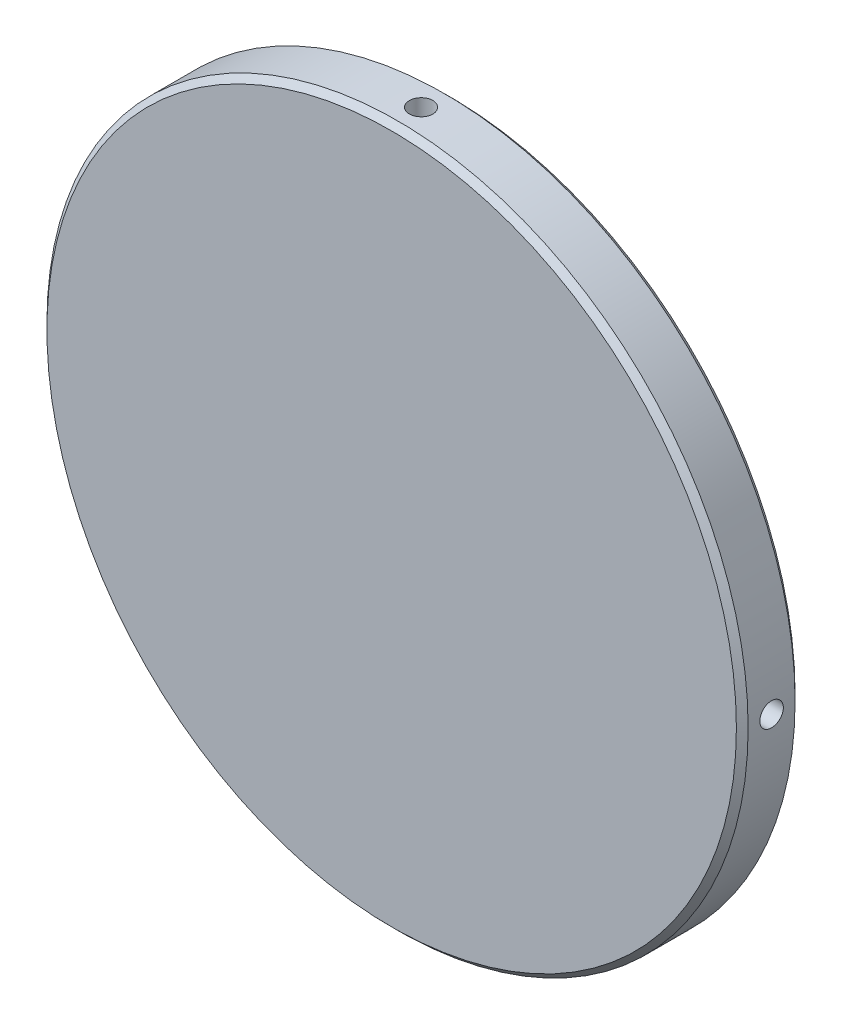
ISO-10303-21;
HEADER;
FILE_DESCRIPTION(('STEP AP214'),'2;1');
FILE_NAME('part.step','',(''),(''),'','','');
FILE_SCHEMA(('AUTOMOTIVE_DESIGN { 1 0 10303 214 1 1 1 1 }'));
ENDSEC;
DATA;
#1=APPLICATION_CONTEXT('core data for automotive mechanical design processes');
#2=APPLICATION_PROTOCOL_DEFINITION('international standard','automotive_design',2000,#1);
#3=PRODUCT_CONTEXT('',#1,'mechanical');
#4=PRODUCT('Part','Part','',(#3));
#5=PRODUCT_RELATED_PRODUCT_CATEGORY('part','',(#4));
#6=PRODUCT_DEFINITION_FORMATION('','',#4);
#7=PRODUCT_DEFINITION_CONTEXT('part definition',#1,'design');
#8=PRODUCT_DEFINITION('design','',#6,#7);
#9=PRODUCT_DEFINITION_SHAPE('','',#8);
#10=(LENGTH_UNIT() NAMED_UNIT(*) SI_UNIT(.MILLI.,.METRE.));
#11=(NAMED_UNIT(*) PLANE_ANGLE_UNIT() SI_UNIT($,.RADIAN.));
#12=(NAMED_UNIT(*) SI_UNIT($,.STERADIAN.) SOLID_ANGLE_UNIT());
#13=UNCERTAINTY_MEASURE_WITH_UNIT(LENGTH_MEASURE(1.E-05),#10,'distance_accuracy_value','');
#14=(GEOMETRIC_REPRESENTATION_CONTEXT(3) GLOBAL_UNCERTAINTY_ASSIGNED_CONTEXT((#13)) GLOBAL_UNIT_ASSIGNED_CONTEXT((#10,
#11,#12)) REPRESENTATION_CONTEXT('',''));
#15=CARTESIAN_POINT('',(0.,0.,0.));
#16=DIRECTION('',(0.,0.,1.));
#17=DIRECTION('',(1.,0.,0.));
#18=AXIS2_PLACEMENT_3D('',#15,#16,#17);
#19=CARTESIAN_POINT('',(0.,0.,5.));
#20=DIRECTION('',(0.,0.,-1.));
#21=DIRECTION('',(-1.,0.,0.));
#22=AXIS2_PLACEMENT_3D('',#19,#20,#21);
#23=CYLINDRICAL_SURFACE('',#22,59.75);
#24=CARTESIAN_POINT('',(-59.75,0.,2.));
#25=CARTESIAN_POINT('',(-59.7499995494594,-0.112307129997341,1.99999503000864));
#26=CARTESIAN_POINT('',(-59.7496799623201,-0.224694892246602,1.99050857638082));
#27=CARTESIAN_POINT('',(-59.74843578904,-0.44637288480864,1.95279816909204));
#28=CARTESIAN_POINT('',(-59.747510481599,-0.555659259858168,1.9245518753627));
#29=CARTESIAN_POINT('',(-59.7451596481446,-0.767890990604416,1.85012887181395));
#30=CARTESIAN_POINT('',(-59.7437343682783,-0.870839437334808,1.80396098398917));
#31=CARTESIAN_POINT('',(-59.7405443243233,-1.06749626686225,1.69501810962479));
#32=CARTESIAN_POINT('',(-59.7387796427583,-1.16120688742617,1.6322471586408));
#33=CARTESIAN_POINT('',(-59.7351084200542,-1.33680655707057,1.49184132171374));
#34=CARTESIAN_POINT('',(-59.7332018148393,-1.41869021685021,1.41419969676134));
#35=CARTESIAN_POINT('',(-59.7294621934981,-1.56826610153817,1.24626867404818));
#36=CARTESIAN_POINT('',(-59.7276291803151,-1.6359577592841,1.15597877105813));
#37=CARTESIAN_POINT('',(-59.7242430934818,-1.75523823779969,0.965292006070528));
#38=CARTESIAN_POINT('',(-59.7226900805231,-1.8068235692095,0.864892960196646));
#39=CARTESIAN_POINT('',(-59.720039760799,-1.89240446748466,0.656853382837109));
#40=CARTESIAN_POINT('',(-59.7189424519817,-1.92640011355139,0.549212883960141));
#41=CARTESIAN_POINT('',(-59.7173277687406,-1.97582434920251,0.329788961371232));
#42=CARTESIAN_POINT('',(-59.7168101754089,-1.99125994745508,0.218007117966453));
#43=CARTESIAN_POINT('',(-59.7164126269457,-2.00314752593443,-0.00656223973413725));
#44=CARTESIAN_POINT('',(-59.7165326689263,-1.99959959213284,-0.11934974947323));
#45=CARTESIAN_POINT('',(-59.7173966504134,-1.97362672232544,-0.342681262555111));
#46=CARTESIAN_POINT('',(-59.718140339607,-1.95120935991124,-0.453226147788876));
#47=CARTESIAN_POINT('',(-59.7201673876427,-1.88814569901528,-0.668982714899182));
#48=CARTESIAN_POINT('',(-59.7214507478238,-1.84749935530442,-0.77419438354241));
#49=CARTESIAN_POINT('',(-59.724412758355,-1.74912284593875,-0.976322323621341));
#50=CARTESIAN_POINT('',(-59.7260914889563,-1.69138921134002,-1.07323690548402));
#51=CARTESIAN_POINT('',(-59.7296549181386,-1.56047953389872,-1.25600109518055));
#52=CARTESIAN_POINT('',(-59.7315396173256,-1.48730344561042,-1.34185067044989));
#53=CARTESIAN_POINT('',(-59.7353036411625,-1.32754323552336,-1.50009200397242));
#54=CARTESIAN_POINT('',(-59.7371829627191,-1.24095254817405,-1.57247713389565));
#55=CARTESIAN_POINT('',(-59.7407234875021,-1.05684428323877,-1.70168378480539));
#56=CARTESIAN_POINT('',(-59.7423846906912,-0.959326703778446,-1.75850530312217));
#57=CARTESIAN_POINT('',(-59.7453017515693,-0.756129117794124,-1.85497104580186));
#58=CARTESIAN_POINT('',(-59.7465576042649,-0.650449010737833,-1.89461505856136));
#59=CARTESIAN_POINT('',(-59.7485223224016,-0.433927916839957,-1.9555961926478));
#60=CARTESIAN_POINT('',(-59.7492311896904,-0.323086947433499,-1.97693337581661));
#61=CARTESIAN_POINT('',(-59.7500217960191,-0.0994480965300977,-2.00068703588301));
#62=CARTESIAN_POINT('',(-59.7501038390329,0.0133488098461575,-2.0031126838075));
#63=CARTESIAN_POINT('',(-59.74963235433,0.237748216697406,-1.9889983220716));
#64=CARTESIAN_POINT('',(-59.7490788275375,0.349350718909133,-1.97245833999215));
#65=CARTESIAN_POINT('',(-59.7473987769684,0.568167735009509,-1.92088981902588));
#66=CARTESIAN_POINT('',(-59.7462723823469,0.67538323207993,-1.88586544744381));
#67=CARTESIAN_POINT('',(-59.7435735083395,0.882412975055238,-1.79832659112254));
#68=CARTESIAN_POINT('',(-59.7420010278256,0.982227202245687,-1.74581206216055));
#69=CARTESIAN_POINT('',(-59.7385863325639,1.17166323795131,-1.62475999218066));
#70=CARTESIAN_POINT('',(-59.7367440140705,1.26128110258538,-1.55621628229767));
#71=CARTESIAN_POINT('',(-59.7329975979015,1.42774087152736,-1.40506060829181));
#72=CARTESIAN_POINT('',(-59.7310935000354,1.50458273642679,-1.32244860077587));
#73=CARTESIAN_POINT('',(-59.7274373090444,1.64333990377229,-1.14546206479679));
#74=CARTESIAN_POINT('',(-59.7256852763786,1.70524928651931,-1.05108289388213));
#75=CARTESIAN_POINT('',(-59.7225317048952,1.81234364178051,-0.853264761031606));
#76=CARTESIAN_POINT('',(-59.721130165186,1.85752865684077,-0.74982582214423));
#77=CARTESIAN_POINT('',(-59.71883603554,1.92988127152684,-0.536846643981409));
#78=CARTESIAN_POINT('',(-59.7179433376335,1.95705269360931,-0.427307704467907));
#79=CARTESIAN_POINT('',(-59.7167672399918,1.9926193508434,-0.205219560769743));
#80=CARTESIAN_POINT('',(-59.7164838393189,2.00101461488827,-0.0926703612176207));
#81=CARTESIAN_POINT('',(-59.7165583280262,1.99879021204282,0.132184275801783));
#82=CARTESIAN_POINT('',(-59.7169159027398,1.98817987535172,0.244489805793972));
#83=CARTESIAN_POINT('',(-59.7182313713311,1.94826466733698,0.465724501536171));
#84=CARTESIAN_POINT('',(-59.7191892663936,1.91895975911528,0.574653660621688));
#85=CARTESIAN_POINT('',(-59.7215973407515,1.8424887206737,0.786046649476031));
#86=CARTESIAN_POINT('',(-59.7230475278561,1.79532230711185,0.88851037665185));
#87=CARTESIAN_POINT('',(-59.7262766495666,1.68446986761081,1.08406317603627));
#88=CARTESIAN_POINT('',(-59.7280555725325,1.62078442655538,1.17715257999648));
#89=CARTESIAN_POINT('',(-59.7317425486591,1.47867243456736,1.35135827985876));
#90=CARTESIAN_POINT('',(-59.7336506511601,1.40024023053822,1.43246996280219));
#91=CARTESIAN_POINT('',(-59.7373808573279,1.23084895277022,1.58039739392635));
#92=CARTESIAN_POINT('',(-59.739202939603,1.13988678483117,1.64720960049673));
#93=CARTESIAN_POINT('',(-59.7425564382163,0.947977189914769,1.76465558393842));
#94=CARTESIAN_POINT('',(-59.7440876529884,0.847022911732809,1.815278158156));
#95=CARTESIAN_POINT('',(-59.7466833240624,0.638120657191286,1.89879623936388));
#96=CARTESIAN_POINT('',(-59.7477483359508,0.530181182413261,1.9317128577802));
#97=CARTESIAN_POINT('',(-59.7490073617991,0.351301159246687,1.97017369093094));
#98=CARTESIAN_POINT('',(-59.74937798314,0.281521364538284,1.98134445497179));
#99=CARTESIAN_POINT('',(-59.7498744438112,0.141171668303215,1.99625917032665));
#100=CARTESIAN_POINT('',(-59.7500002832319,0.0706017670680063,2.00000312438019));
#101=CARTESIAN_POINT('',(-59.75,0.,2.));
#102=B_SPLINE_CURVE_WITH_KNOTS('',3,(#24,#25,#26,#27,#28,#29,#30,#31,#32,#33,#34,#35,#36,#37,
#38,#39,#40,#41,#42,#43,#44,#45,#46,#47,#48,#49,#50,#51,#52,#53,#54,#55,#56,#57,#58,#59,#60,#61,
#62,#63,#64,#65,#66,#67,#68,#69,#70,#71,#72,#73,#74,#75,#76,#77,#78,#79,#80,#81,#82,#83,#84,#85,
#86,#87,#88,#89,#90,#91,#92,#93,#94,#95,#96,#97,#98,#99,#100,#101),.UNSPECIFIED.,.T.,.F.,(4,2,2,
2,2,2,2,2,2,2,2,2,2,2,2,2,2,2,2,2,2,2,2,2,2,2,2,2,2,2,2,2,2,2,2,2,2,2,4),(0.,0.336663682027249,
0.673728999013756,1.01062860388358,1.34744639675886,1.68441718955387,2.02140144632314,
2.35845865857089,2.69551435313184,3.03244272829218,3.36936957758993,3.70616125955853,
4.0429537771675,4.37981471502453,4.71667664424653,5.05370396882304,5.39073135121246,
5.72776288520078,6.06479328066593,6.40166022524484,6.73852667993279,7.07531722051715,
7.41210861266226,7.74902983363537,8.08595209384654,8.42300770176811,8.76006245222878,
9.09704565727869,9.43402834376934,9.77084564459304,10.1076636102055,10.4444869190778,
10.7812983037856,11.118239067648,11.4552631866949,11.7925200124573,12.1293738187843,
12.3410171901982,12.5526604835431),.UNSPECIFIED.);
#103=CARTESIAN_POINT('',(-59.75,0.,2.));
#104=VERTEX_POINT('',#103);
#105=EDGE_CURVE('E38',#104,#104,#102,.T.);
#106=ORIENTED_EDGE('',*,*,#105,.T.);
#107=EDGE_LOOP('',(#106));
#108=FACE_BOUND('',#107,.T.);
#109=CARTESIAN_POINT('',(0.,-59.75,2.));
#110=CARTESIAN_POINT('',(0.112307129997341,-59.7499995494594,1.99999503000864));
#111=CARTESIAN_POINT('',(0.224694892246602,-59.7496799623201,1.99050857638082));
#112=CARTESIAN_POINT('',(0.44637288480864,-59.74843578904,1.95279816909204));
#113=CARTESIAN_POINT('',(0.555659259858168,-59.747510481599,1.9245518753627));
#114=CARTESIAN_POINT('',(0.767890990604416,-59.7451596481446,1.85012887181395));
#115=CARTESIAN_POINT('',(0.870839437334808,-59.7437343682783,1.80396098398917));
#116=CARTESIAN_POINT('',(1.06749626686225,-59.7405443243233,1.69501810962479));
#117=CARTESIAN_POINT('',(1.16120688742617,-59.7387796427583,1.6322471586408));
#118=CARTESIAN_POINT('',(1.33680655707057,-59.7351084200542,1.49184132171374));
#119=CARTESIAN_POINT('',(1.41869021685021,-59.7332018148393,1.41419969676134));
#120=CARTESIAN_POINT('',(1.56826610153817,-59.7294621934981,1.24626867404818));
#121=CARTESIAN_POINT('',(1.6359577592841,-59.7276291803151,1.15597877105813));
#122=CARTESIAN_POINT('',(1.75523823779969,-59.7242430934818,0.965292006070528));
#123=CARTESIAN_POINT('',(1.8068235692095,-59.7226900805231,0.864892960196646));
#124=CARTESIAN_POINT('',(1.89240446748466,-59.720039760799,0.656853382837109));
#125=CARTESIAN_POINT('',(1.92640011355139,-59.7189424519817,0.549212883960141));
#126=CARTESIAN_POINT('',(1.97582434920251,-59.7173277687406,0.329788961371232));
#127=CARTESIAN_POINT('',(1.99125994745508,-59.7168101754089,0.218007117966453));
#128=CARTESIAN_POINT('',(2.00314752593443,-59.7164126269457,-0.00656223973413725));
#129=CARTESIAN_POINT('',(1.99959959213284,-59.7165326689263,-0.11934974947323));
#130=CARTESIAN_POINT('',(1.97362672232544,-59.7173966504134,-0.342681262555111));
#131=CARTESIAN_POINT('',(1.95120935991124,-59.718140339607,-0.453226147788876));
#132=CARTESIAN_POINT('',(1.88814569901528,-59.7201673876427,-0.668982714899182));
#133=CARTESIAN_POINT('',(1.84749935530442,-59.7214507478238,-0.77419438354241));
#134=CARTESIAN_POINT('',(1.74912284593875,-59.724412758355,-0.976322323621341));
#135=CARTESIAN_POINT('',(1.69138921134002,-59.7260914889563,-1.07323690548402));
#136=CARTESIAN_POINT('',(1.56047953389872,-59.7296549181386,-1.25600109518055));
#137=CARTESIAN_POINT('',(1.48730344561042,-59.7315396173256,-1.34185067044989));
#138=CARTESIAN_POINT('',(1.32754323552336,-59.7353036411625,-1.50009200397242));
#139=CARTESIAN_POINT('',(1.24095254817405,-59.7371829627191,-1.57247713389565));
#140=CARTESIAN_POINT('',(1.05684428323877,-59.7407234875021,-1.70168378480539));
#141=CARTESIAN_POINT('',(0.959326703778446,-59.7423846906912,-1.75850530312217));
#142=CARTESIAN_POINT('',(0.756129117794124,-59.7453017515693,-1.85497104580186));
#143=CARTESIAN_POINT('',(0.650449010737833,-59.7465576042649,-1.89461505856136));
#144=CARTESIAN_POINT('',(0.433927916839957,-59.7485223224016,-1.9555961926478));
#145=CARTESIAN_POINT('',(0.323086947433499,-59.7492311896904,-1.97693337581661));
#146=CARTESIAN_POINT('',(0.0994480965300977,-59.7500217960191,-2.00068703588301));
#147=CARTESIAN_POINT('',(-0.0133488098461575,-59.7501038390329,-2.0031126838075));
#148=CARTESIAN_POINT('',(-0.237748216697406,-59.74963235433,-1.9889983220716));
#149=CARTESIAN_POINT('',(-0.349350718909133,-59.7490788275375,-1.97245833999215));
#150=CARTESIAN_POINT('',(-0.568167735009509,-59.7473987769684,-1.92088981902588));
#151=CARTESIAN_POINT('',(-0.67538323207993,-59.7462723823469,-1.88586544744381));
#152=CARTESIAN_POINT('',(-0.882412975055238,-59.7435735083395,-1.79832659112254));
#153=CARTESIAN_POINT('',(-0.982227202245687,-59.7420010278256,-1.74581206216055));
#154=CARTESIAN_POINT('',(-1.17166323795131,-59.7385863325639,-1.62475999218066));
#155=CARTESIAN_POINT('',(-1.26128110258538,-59.7367440140705,-1.55621628229767));
#156=CARTESIAN_POINT('',(-1.42774087152736,-59.7329975979015,-1.40506060829181));
#157=CARTESIAN_POINT('',(-1.50458273642679,-59.7310935000354,-1.32244860077587));
#158=CARTESIAN_POINT('',(-1.64333990377229,-59.7274373090444,-1.14546206479679));
#159=CARTESIAN_POINT('',(-1.70524928651931,-59.7256852763786,-1.05108289388213));
#160=CARTESIAN_POINT('',(-1.81234364178051,-59.7225317048952,-0.853264761031606));
#161=CARTESIAN_POINT('',(-1.85752865684077,-59.721130165186,-0.74982582214423));
#162=CARTESIAN_POINT('',(-1.92988127152684,-59.71883603554,-0.536846643981409));
#163=CARTESIAN_POINT('',(-1.95705269360931,-59.7179433376335,-0.427307704467907));
#164=CARTESIAN_POINT('',(-1.9926193508434,-59.7167672399918,-0.205219560769743));
#165=CARTESIAN_POINT('',(-2.00101461488827,-59.7164838393189,-0.0926703612176207));
#166=CARTESIAN_POINT('',(-1.99879021204282,-59.7165583280262,0.132184275801783));
#167=CARTESIAN_POINT('',(-1.98817987535172,-59.7169159027398,0.244489805793972));
#168=CARTESIAN_POINT('',(-1.94826466733698,-59.7182313713311,0.465724501536171));
#169=CARTESIAN_POINT('',(-1.91895975911528,-59.7191892663936,0.574653660621688));
#170=CARTESIAN_POINT('',(-1.8424887206737,-59.7215973407515,0.786046649476031));
#171=CARTESIAN_POINT('',(-1.79532230711185,-59.7230475278561,0.88851037665185));
#172=CARTESIAN_POINT('',(-1.68446986761081,-59.7262766495666,1.08406317603627));
#173=CARTESIAN_POINT('',(-1.62078442655538,-59.7280555725325,1.17715257999648));
#174=CARTESIAN_POINT('',(-1.47867243456736,-59.7317425486591,1.35135827985876));
#175=CARTESIAN_POINT('',(-1.40024023053822,-59.7336506511601,1.43246996280219));
#176=CARTESIAN_POINT('',(-1.23084895277022,-59.7373808573279,1.58039739392635));
#177=CARTESIAN_POINT('',(-1.13988678483117,-59.739202939603,1.64720960049673));
#178=CARTESIAN_POINT('',(-0.947977189914769,-59.7425564382163,1.76465558393842));
#179=CARTESIAN_POINT('',(-0.847022911732809,-59.7440876529884,1.815278158156));
#180=CARTESIAN_POINT('',(-0.638120657191286,-59.7466833240624,1.89879623936388));
#181=CARTESIAN_POINT('',(-0.530181182413261,-59.7477483359508,1.9317128577802));
#182=CARTESIAN_POINT('',(-0.351301159246687,-59.7490073617991,1.97017369093094));
#183=CARTESIAN_POINT('',(-0.281521364538284,-59.74937798314,1.98134445497179));
#184=CARTESIAN_POINT('',(-0.141171668303215,-59.7498744438112,1.99625917032665));
#185=CARTESIAN_POINT('',(-0.0706017670680063,-59.7500002832319,2.00000312438019));
#186=CARTESIAN_POINT('',(0.,-59.75,2.));
#187=B_SPLINE_CURVE_WITH_KNOTS('',3,(#109,#110,#111,#112,#113,#114,#115,#116,#117,#118,#119,
#120,#121,#122,#123,#124,#125,#126,#127,#128,#129,#130,#131,#132,#133,#134,#135,#136,#137,#138,
#139,#140,#141,#142,#143,#144,#145,#146,#147,#148,#149,#150,#151,#152,#153,#154,#155,#156,#157,
#158,#159,#160,#161,#162,#163,#164,#165,#166,#167,#168,#169,#170,#171,#172,#173,#174,#175,#176,
#177,#178,#179,#180,#181,#182,#183,#184,#185,#186),.UNSPECIFIED.,.T.,.F.,(4,2,2,2,2,2,2,2,2,2,2,
2,2,2,2,2,2,2,2,2,2,2,2,2,2,2,2,2,2,2,2,2,2,2,2,2,2,2,4),(0.,0.336663682027249,
0.673728999013756,1.01062860388358,1.34744639675886,1.68441718955387,2.02140144632314,
2.35845865857089,2.69551435313184,3.03244272829218,3.36936957758993,3.70616125955853,
4.0429537771675,4.37981471502453,4.71667664424653,5.05370396882304,5.39073135121246,
5.72776288520078,6.06479328066593,6.40166022524484,6.73852667993279,7.07531722051715,
7.41210861266226,7.74902983363537,8.08595209384654,8.42300770176811,8.76006245222878,
9.09704565727869,9.43402834376934,9.77084564459304,10.1076636102055,10.4444869190778,
10.7812983037856,11.118239067648,11.4552631866949,11.7925200124573,12.1293738187843,
12.3410171901982,12.5526604835431),.UNSPECIFIED.);
#188=CARTESIAN_POINT('',(0.,-59.75,2.));
#189=VERTEX_POINT('',#188);
#190=EDGE_CURVE('E65',#189,#189,#187,.T.);
#191=ORIENTED_EDGE('',*,*,#190,.T.);
#192=EDGE_LOOP('',(#191));
#193=FACE_BOUND('',#192,.T.);
#194=CARTESIAN_POINT('',(0.,0.,-3.99999999999999));
#195=DIRECTION('',(0.,0.,1.));
#196=DIRECTION('',(1.,0.,0.));
#197=AXIS2_PLACEMENT_3D('',#194,#195,#196);
#198=CIRCLE('',#197,59.75);
#199=CARTESIAN_POINT('',(59.75,0.,-3.99999999999999));
#200=VERTEX_POINT('',#199);
#201=EDGE_CURVE('E52',#200,#200,#198,.T.);
#202=ORIENTED_EDGE('',*,*,#201,.T.);
#203=EDGE_LOOP('',(#202));
#204=FACE_BOUND('',#203,.T.);
#205=CARTESIAN_POINT('',(0.,0.,3.99999999999994));
#206=DIRECTION('',(0.,0.,1.));
#207=DIRECTION('',(1.,0.,0.));
#208=AXIS2_PLACEMENT_3D('',#205,#206,#207);
#209=CIRCLE('',#208,59.75);
#210=CARTESIAN_POINT('',(59.75,0.,3.99999999999994));
#211=VERTEX_POINT('',#210);
#212=EDGE_CURVE('E63',#211,#211,#209,.F.);
#213=ORIENTED_EDGE('',*,*,#212,.T.);
#214=EDGE_LOOP('',(#213));
#215=FACE_BOUND('',#214,.T.);
#216=CARTESIAN_POINT('',(0.,59.75,-2.));
#217=CARTESIAN_POINT('',(-0.112307129997341,59.7499995494594,-1.99999503000864));
#218=CARTESIAN_POINT('',(-0.224694892246602,59.7496799623201,-1.99050857638082));
#219=CARTESIAN_POINT('',(-0.44637288480864,59.74843578904,-1.95279816909204));
#220=CARTESIAN_POINT('',(-0.555659259858168,59.747510481599,-1.9245518753627));
#221=CARTESIAN_POINT('',(-0.767890990604416,59.7451596481446,-1.85012887181395));
#222=CARTESIAN_POINT('',(-0.870839437334808,59.7437343682783,-1.80396098398917));
#223=CARTESIAN_POINT('',(-1.06749626686225,59.7405443243233,-1.69501810962479));
#224=CARTESIAN_POINT('',(-1.16120688742617,59.7387796427583,-1.6322471586408));
#225=CARTESIAN_POINT('',(-1.33680655707057,59.7351084200542,-1.49184132171374));
#226=CARTESIAN_POINT('',(-1.41869021685021,59.7332018148393,-1.41419969676134));
#227=CARTESIAN_POINT('',(-1.56826610153817,59.7294621934981,-1.24626867404818));
#228=CARTESIAN_POINT('',(-1.6359577592841,59.7276291803151,-1.15597877105813));
#229=CARTESIAN_POINT('',(-1.75523823779969,59.7242430934818,-0.965292006070528));
#230=CARTESIAN_POINT('',(-1.8068235692095,59.7226900805231,-0.864892960196646));
#231=CARTESIAN_POINT('',(-1.89240446748466,59.720039760799,-0.656853382837109));
#232=CARTESIAN_POINT('',(-1.92640011355139,59.7189424519817,-0.549212883960141));
#233=CARTESIAN_POINT('',(-1.97582434920251,59.7173277687406,-0.329788961371232));
#234=CARTESIAN_POINT('',(-1.99125994745508,59.7168101754089,-0.218007117966453));
#235=CARTESIAN_POINT('',(-2.00314752593443,59.7164126269457,0.00656223973413725));
#236=CARTESIAN_POINT('',(-1.99959959213284,59.7165326689263,0.11934974947323));
#237=CARTESIAN_POINT('',(-1.97362672232544,59.7173966504134,0.342681262555111));
#238=CARTESIAN_POINT('',(-1.95120935991124,59.718140339607,0.453226147788876));
#239=CARTESIAN_POINT('',(-1.88814569901528,59.7201673876427,0.668982714899182));
#240=CARTESIAN_POINT('',(-1.84749935530442,59.7214507478238,0.77419438354241));
#241=CARTESIAN_POINT('',(-1.74912284593875,59.724412758355,0.976322323621341));
#242=CARTESIAN_POINT('',(-1.69138921134002,59.7260914889563,1.07323690548402));
#243=CARTESIAN_POINT('',(-1.56047953389872,59.7296549181386,1.25600109518055));
#244=CARTESIAN_POINT('',(-1.48730344561042,59.7315396173256,1.34185067044989));
#245=CARTESIAN_POINT('',(-1.32754323552336,59.7353036411625,1.50009200397242));
#246=CARTESIAN_POINT('',(-1.24095254817405,59.7371829627191,1.57247713389565));
#247=CARTESIAN_POINT('',(-1.05684428323877,59.7407234875021,1.70168378480539));
#248=CARTESIAN_POINT('',(-0.959326703778446,59.7423846906912,1.75850530312217));
#249=CARTESIAN_POINT('',(-0.756129117794124,59.7453017515693,1.85497104580186));
#250=CARTESIAN_POINT('',(-0.650449010737833,59.7465576042649,1.89461505856136));
#251=CARTESIAN_POINT('',(-0.433927916839957,59.7485223224016,1.9555961926478));
#252=CARTESIAN_POINT('',(-0.323086947433499,59.7492311896904,1.97693337581661));
#253=CARTESIAN_POINT('',(-0.0994480965300977,59.7500217960191,2.00068703588301));
#254=CARTESIAN_POINT('',(0.0133488098461575,59.7501038390329,2.0031126838075));
#255=CARTESIAN_POINT('',(0.237748216697406,59.74963235433,1.9889983220716));
#256=CARTESIAN_POINT('',(0.349350718909133,59.7490788275375,1.97245833999215));
#257=CARTESIAN_POINT('',(0.568167735009509,59.7473987769684,1.92088981902588));
#258=CARTESIAN_POINT('',(0.67538323207993,59.7462723823469,1.88586544744381));
#259=CARTESIAN_POINT('',(0.882412975055238,59.7435735083395,1.79832659112254));
#260=CARTESIAN_POINT('',(0.982227202245687,59.7420010278256,1.74581206216055));
#261=CARTESIAN_POINT('',(1.17166323795131,59.7385863325639,1.62475999218066));
#262=CARTESIAN_POINT('',(1.26128110258538,59.7367440140705,1.55621628229767));
#263=CARTESIAN_POINT('',(1.42774087152736,59.7329975979015,1.40506060829181));
#264=CARTESIAN_POINT('',(1.50458273642679,59.7310935000354,1.32244860077587));
#265=CARTESIAN_POINT('',(1.64333990377229,59.7274373090444,1.14546206479679));
#266=CARTESIAN_POINT('',(1.70524928651931,59.7256852763786,1.05108289388213));
#267=CARTESIAN_POINT('',(1.81234364178051,59.7225317048952,0.853264761031606));
#268=CARTESIAN_POINT('',(1.85752865684077,59.721130165186,0.74982582214423));
#269=CARTESIAN_POINT('',(1.92988127152684,59.71883603554,0.536846643981409));
#270=CARTESIAN_POINT('',(1.95705269360931,59.7179433376335,0.427307704467907));
#271=CARTESIAN_POINT('',(1.9926193508434,59.7167672399918,0.205219560769743));
#272=CARTESIAN_POINT('',(2.00101461488827,59.7164838393189,0.0926703612176207));
#273=CARTESIAN_POINT('',(1.99879021204282,59.7165583280262,-0.132184275801783));
#274=CARTESIAN_POINT('',(1.98817987535172,59.7169159027398,-0.244489805793972));
#275=CARTESIAN_POINT('',(1.94826466733698,59.7182313713311,-0.465724501536171));
#276=CARTESIAN_POINT('',(1.91895975911528,59.7191892663936,-0.574653660621688));
#277=CARTESIAN_POINT('',(1.8424887206737,59.7215973407515,-0.786046649476031));
#278=CARTESIAN_POINT('',(1.79532230711185,59.7230475278561,-0.88851037665185));
#279=CARTESIAN_POINT('',(1.68446986761081,59.7262766495666,-1.08406317603627));
#280=CARTESIAN_POINT('',(1.62078442655538,59.7280555725325,-1.17715257999648));
#281=CARTESIAN_POINT('',(1.47867243456736,59.7317425486591,-1.35135827985876));
#282=CARTESIAN_POINT('',(1.40024023053822,59.7336506511601,-1.43246996280219));
#283=CARTESIAN_POINT('',(1.23084895277022,59.7373808573279,-1.58039739392635));
#284=CARTESIAN_POINT('',(1.13988678483117,59.739202939603,-1.64720960049673));
#285=CARTESIAN_POINT('',(0.947977189914769,59.7425564382163,-1.76465558393842));
#286=CARTESIAN_POINT('',(0.847022911732809,59.7440876529884,-1.815278158156));
#287=CARTESIAN_POINT('',(0.638120657191286,59.7466833240624,-1.89879623936388));
#288=CARTESIAN_POINT('',(0.530181182413261,59.7477483359508,-1.9317128577802));
#289=CARTESIAN_POINT('',(0.351301159246687,59.7490073617991,-1.97017369093094));
#290=CARTESIAN_POINT('',(0.281521364538284,59.74937798314,-1.98134445497179));
#291=CARTESIAN_POINT('',(0.141171668303215,59.7498744438112,-1.99625917032665));
#292=CARTESIAN_POINT('',(0.0706017670680063,59.7500002832319,-2.00000312438019));
#293=CARTESIAN_POINT('',(0.,59.75,-2.));
#294=B_SPLINE_CURVE_WITH_KNOTS('',3,(#216,#217,#218,#219,#220,#221,#222,#223,#224,#225,#226,
#227,#228,#229,#230,#231,#232,#233,#234,#235,#236,#237,#238,#239,#240,#241,#242,#243,#244,#245,
#246,#247,#248,#249,#250,#251,#252,#253,#254,#255,#256,#257,#258,#259,#260,#261,#262,#263,#264,
#265,#266,#267,#268,#269,#270,#271,#272,#273,#274,#275,#276,#277,#278,#279,#280,#281,#282,#283,
#284,#285,#286,#287,#288,#289,#290,#291,#292,#293),.UNSPECIFIED.,.T.,.F.,(4,2,2,2,2,2,2,2,2,2,2,
2,2,2,2,2,2,2,2,2,2,2,2,2,2,2,2,2,2,2,2,2,2,2,2,2,2,2,4),(0.,0.336663682027249,
0.673728999013756,1.01062860388358,1.34744639675886,1.68441718955387,2.02140144632314,
2.35845865857089,2.69551435313184,3.03244272829218,3.36936957758993,3.70616125955853,
4.0429537771675,4.37981471502453,4.71667664424653,5.05370396882304,5.39073135121246,
5.72776288520078,6.06479328066593,6.40166022524484,6.73852667993279,7.07531722051715,
7.41210861266226,7.74902983363537,8.08595209384654,8.42300770176811,8.76006245222878,
9.09704565727869,9.43402834376934,9.77084564459304,10.1076636102055,10.4444869190778,
10.7812983037856,11.118239067648,11.4552631866949,11.7925200124573,12.1293738187843,
12.3410171901982,12.5526604835431),.UNSPECIFIED.);
#295=CARTESIAN_POINT('',(0.,59.75,-2.));
#296=VERTEX_POINT('',#295);
#297=EDGE_CURVE('E56',#296,#296,#294,.T.);
#298=ORIENTED_EDGE('',*,*,#297,.F.);
#299=EDGE_LOOP('',(#298));
#300=FACE_BOUND('',#299,.T.);
#301=CARTESIAN_POINT('',(59.75,0.,2.));
#302=CARTESIAN_POINT('',(59.7499995494594,-0.112307129997341,1.99999503000864));
#303=CARTESIAN_POINT('',(59.7496799623201,-0.224694892246602,1.99050857638082));
#304=CARTESIAN_POINT('',(59.74843578904,-0.44637288480864,1.95279816909204));
#305=CARTESIAN_POINT('',(59.747510481599,-0.555659259858168,1.9245518753627));
#306=CARTESIAN_POINT('',(59.7451596481446,-0.767890990604416,1.85012887181395));
#307=CARTESIAN_POINT('',(59.7437343682783,-0.870839437334808,1.80396098398917));
#308=CARTESIAN_POINT('',(59.7405443243233,-1.06749626686225,1.69501810962479));
#309=CARTESIAN_POINT('',(59.7387796427583,-1.16120688742617,1.6322471586408));
#310=CARTESIAN_POINT('',(59.7351084200542,-1.33680655707057,1.49184132171374));
#311=CARTESIAN_POINT('',(59.7332018148393,-1.41869021685021,1.41419969676134));
#312=CARTESIAN_POINT('',(59.7294621934981,-1.56826610153817,1.24626867404818));
#313=CARTESIAN_POINT('',(59.7276291803151,-1.6359577592841,1.15597877105813));
#314=CARTESIAN_POINT('',(59.7242430934818,-1.75523823779969,0.965292006070528));
#315=CARTESIAN_POINT('',(59.7226900805231,-1.8068235692095,0.864892960196646));
#316=CARTESIAN_POINT('',(59.720039760799,-1.89240446748466,0.656853382837109));
#317=CARTESIAN_POINT('',(59.7189424519817,-1.92640011355139,0.549212883960141));
#318=CARTESIAN_POINT('',(59.7173277687406,-1.97582434920251,0.329788961371232));
#319=CARTESIAN_POINT('',(59.7168101754089,-1.99125994745508,0.218007117966453));
#320=CARTESIAN_POINT('',(59.7164126269457,-2.00314752593443,-0.00656223973413725));
#321=CARTESIAN_POINT('',(59.7165326689263,-1.99959959213284,-0.11934974947323));
#322=CARTESIAN_POINT('',(59.7173966504134,-1.97362672232544,-0.342681262555111));
#323=CARTESIAN_POINT('',(59.718140339607,-1.95120935991124,-0.453226147788876));
#324=CARTESIAN_POINT('',(59.7201673876427,-1.88814569901528,-0.668982714899182));
#325=CARTESIAN_POINT('',(59.7214507478238,-1.84749935530442,-0.77419438354241));
#326=CARTESIAN_POINT('',(59.724412758355,-1.74912284593875,-0.976322323621341));
#327=CARTESIAN_POINT('',(59.7260914889563,-1.69138921134002,-1.07323690548402));
#328=CARTESIAN_POINT('',(59.7296549181386,-1.56047953389872,-1.25600109518055));
#329=CARTESIAN_POINT('',(59.7315396173256,-1.48730344561042,-1.34185067044989));
#330=CARTESIAN_POINT('',(59.7353036411625,-1.32754323552336,-1.50009200397242));
#331=CARTESIAN_POINT('',(59.7371829627191,-1.24095254817405,-1.57247713389565));
#332=CARTESIAN_POINT('',(59.7407234875021,-1.05684428323877,-1.70168378480539));
#333=CARTESIAN_POINT('',(59.7423846906912,-0.959326703778446,-1.75850530312217));
#334=CARTESIAN_POINT('',(59.7453017515693,-0.756129117794124,-1.85497104580186));
#335=CARTESIAN_POINT('',(59.7465576042649,-0.650449010737833,-1.89461505856136));
#336=CARTESIAN_POINT('',(59.7485223224016,-0.433927916839957,-1.9555961926478));
#337=CARTESIAN_POINT('',(59.7492311896904,-0.323086947433499,-1.97693337581661));
#338=CARTESIAN_POINT('',(59.7500217960191,-0.0994480965300977,-2.00068703588301));
#339=CARTESIAN_POINT('',(59.7501038390329,0.0133488098461575,-2.0031126838075));
#340=CARTESIAN_POINT('',(59.74963235433,0.237748216697406,-1.9889983220716));
#341=CARTESIAN_POINT('',(59.7490788275375,0.349350718909133,-1.97245833999215));
#342=CARTESIAN_POINT('',(59.7473987769684,0.568167735009509,-1.92088981902588));
#343=CARTESIAN_POINT('',(59.7462723823469,0.67538323207993,-1.88586544744381));
#344=CARTESIAN_POINT('',(59.7435735083395,0.882412975055238,-1.79832659112254));
#345=CARTESIAN_POINT('',(59.7420010278256,0.982227202245687,-1.74581206216055));
#346=CARTESIAN_POINT('',(59.7385863325639,1.17166323795131,-1.62475999218066));
#347=CARTESIAN_POINT('',(59.7367440140705,1.26128110258538,-1.55621628229767));
#348=CARTESIAN_POINT('',(59.7329975979015,1.42774087152736,-1.40506060829181));
#349=CARTESIAN_POINT('',(59.7310935000354,1.50458273642679,-1.32244860077587));
#350=CARTESIAN_POINT('',(59.7274373090444,1.64333990377229,-1.14546206479679));
#351=CARTESIAN_POINT('',(59.7256852763786,1.70524928651931,-1.05108289388213));
#352=CARTESIAN_POINT('',(59.7225317048952,1.81234364178051,-0.853264761031606));
#353=CARTESIAN_POINT('',(59.721130165186,1.85752865684077,-0.74982582214423));
#354=CARTESIAN_POINT('',(59.71883603554,1.92988127152684,-0.536846643981409));
#355=CARTESIAN_POINT('',(59.7179433376335,1.95705269360931,-0.427307704467907));
#356=CARTESIAN_POINT('',(59.7167672399918,1.9926193508434,-0.205219560769743));
#357=CARTESIAN_POINT('',(59.7164838393189,2.00101461488827,-0.0926703612176207));
#358=CARTESIAN_POINT('',(59.7165583280262,1.99879021204282,0.132184275801783));
#359=CARTESIAN_POINT('',(59.7169159027398,1.98817987535172,0.244489805793972));
#360=CARTESIAN_POINT('',(59.7182313713311,1.94826466733698,0.465724501536171));
#361=CARTESIAN_POINT('',(59.7191892663936,1.91895975911528,0.574653660621688));
#362=CARTESIAN_POINT('',(59.7215973407515,1.8424887206737,0.786046649476031));
#363=CARTESIAN_POINT('',(59.7230475278561,1.79532230711185,0.88851037665185));
#364=CARTESIAN_POINT('',(59.7262766495666,1.68446986761081,1.08406317603627));
#365=CARTESIAN_POINT('',(59.7280555725325,1.62078442655538,1.17715257999648));
#366=CARTESIAN_POINT('',(59.7317425486591,1.47867243456736,1.35135827985876));
#367=CARTESIAN_POINT('',(59.7336506511601,1.40024023053822,1.43246996280219));
#368=CARTESIAN_POINT('',(59.7373808573279,1.23084895277022,1.58039739392635));
#369=CARTESIAN_POINT('',(59.739202939603,1.13988678483117,1.64720960049673));
#370=CARTESIAN_POINT('',(59.7425564382163,0.947977189914769,1.76465558393842));
#371=CARTESIAN_POINT('',(59.7440876529884,0.847022911732809,1.815278158156));
#372=CARTESIAN_POINT('',(59.7466833240624,0.638120657191286,1.89879623936388));
#373=CARTESIAN_POINT('',(59.7477483359508,0.530181182413261,1.9317128577802));
#374=CARTESIAN_POINT('',(59.7490073617991,0.351301159246687,1.97017369093094));
#375=CARTESIAN_POINT('',(59.74937798314,0.281521364538284,1.98134445497179));
#376=CARTESIAN_POINT('',(59.7498744438112,0.141171668303215,1.99625917032665));
#377=CARTESIAN_POINT('',(59.7500002832319,0.0706017670680063,2.00000312438019));
#378=CARTESIAN_POINT('',(59.75,0.,2.));
#379=B_SPLINE_CURVE_WITH_KNOTS('',3,(#301,#302,#303,#304,#305,#306,#307,#308,#309,#310,#311,
#312,#313,#314,#315,#316,#317,#318,#319,#320,#321,#322,#323,#324,#325,#326,#327,#328,#329,#330,
#331,#332,#333,#334,#335,#336,#337,#338,#339,#340,#341,#342,#343,#344,#345,#346,#347,#348,#349,
#350,#351,#352,#353,#354,#355,#356,#357,#358,#359,#360,#361,#362,#363,#364,#365,#366,#367,#368,
#369,#370,#371,#372,#373,#374,#375,#376,#377,#378),.UNSPECIFIED.,.T.,.F.,(4,2,2,2,2,2,2,2,2,2,2,
2,2,2,2,2,2,2,2,2,2,2,2,2,2,2,2,2,2,2,2,2,2,2,2,2,2,2,4),(0.,0.336663682027249,
0.673728999013756,1.01062860388358,1.34744639675886,1.68441718955387,2.02140144632314,
2.35845865857089,2.69551435313184,3.03244272829218,3.36936957758993,3.70616125955853,
4.0429537771675,4.37981471502453,4.71667664424653,5.05370396882304,5.39073135121246,
5.72776288520078,6.06479328066593,6.40166022524484,6.73852667993279,7.07531722051715,
7.41210861266226,7.74902983363537,8.08595209384654,8.42300770176811,8.76006245222878,
9.09704565727869,9.43402834376934,9.77084564459304,10.1076636102055,10.4444869190778,
10.7812983037856,11.118239067648,11.4552631866949,11.7925200124573,12.1293738187843,
12.3410171901982,12.5526604835431),.UNSPECIFIED.);
#380=CARTESIAN_POINT('',(59.75,0.,2.));
#381=VERTEX_POINT('',#380);
#382=EDGE_CURVE('E109',#381,#381,#379,.T.);
#383=ORIENTED_EDGE('',*,*,#382,.F.);
#384=EDGE_LOOP('',(#383));
#385=FACE_BOUND('',#384,.T.);
#386=ADVANCED_FACE('F33',(#108,#193,#204,#215,#300,#385),#23,.T.);
#387=CARTESIAN_POINT('',(0.,0.,5.));
#388=DIRECTION('',(0.,0.,1.));
#389=DIRECTION('',(1.,0.,0.));
#390=AXIS2_PLACEMENT_3D('',#387,#388,#389);
#391=PLANE('',#390);
#392=CARTESIAN_POINT('',(0.,0.,5.));
#393=DIRECTION('',(0.,0.,1.));
#394=DIRECTION('',(1.,0.,0.));
#395=AXIS2_PLACEMENT_3D('',#392,#393,#394);
#396=CIRCLE('',#395,58.75);
#397=CARTESIAN_POINT('',(58.75,0.,5.));
#398=VERTEX_POINT('',#397);
#399=EDGE_CURVE('E10',#398,#398,#396,.T.);
#400=ORIENTED_EDGE('',*,*,#399,.T.);
#401=EDGE_LOOP('',(#400));
#402=FACE_BOUND('',#401,.T.);
#403=ADVANCED_FACE('F79',(#402),#391,.T.);
#404=CARTESIAN_POINT('',(0.,0.,-5.));
#405=DIRECTION('',(0.,0.,1.));
#406=DIRECTION('',(1.,0.,0.));
#407=AXIS2_PLACEMENT_3D('',#404,#405,#406);
#408=PLANE('',#407);
#409=CARTESIAN_POINT('',(0.,0.,-5.));
#410=DIRECTION('',(0.,0.,1.));
#411=DIRECTION('',(1.,0.,0.));
#412=AXIS2_PLACEMENT_3D('',#409,#410,#411);
#413=CIRCLE('',#412,58.75);
#414=CARTESIAN_POINT('',(58.75,0.,-5.));
#415=VERTEX_POINT('',#414);
#416=EDGE_CURVE('E47',#415,#415,#413,.F.);
#417=ORIENTED_EDGE('',*,*,#416,.T.);
#418=EDGE_LOOP('',(#417));
#419=FACE_BOUND('',#418,.T.);
#420=ADVANCED_FACE('F81',(#419),#408,.F.);
#421=CARTESIAN_POINT('',(0.,0.,-3.99999999999999));
#422=DIRECTION('',(0.,0.,1.));
#423=DIRECTION('',(1.,0.,0.));
#424=AXIS2_PLACEMENT_3D('',#421,#422,#423);
#425=CONICAL_SURFACE('',#424,59.75,0.785398163397452);
#426=ORIENTED_EDGE('',*,*,#416,.F.);
#427=EDGE_LOOP('',(#426));
#428=FACE_BOUND('',#427,.T.);
#429=ORIENTED_EDGE('',*,*,#201,.F.);
#430=EDGE_LOOP('',(#429));
#431=FACE_BOUND('',#430,.T.);
#432=ADVANCED_FACE('F83',(#428,#431),#425,.T.);
#433=CARTESIAN_POINT('',(0.,0.,5.));
#434=DIRECTION('',(0.,0.,-1.));
#435=DIRECTION('',(-1.,0.,0.));
#436=AXIS2_PLACEMENT_3D('',#433,#434,#435);
#437=CONICAL_SURFACE('',#436,58.75,0.785398163397445);
#438=ORIENTED_EDGE('',*,*,#212,.F.);
#439=EDGE_LOOP('',(#438));
#440=FACE_BOUND('',#439,.T.);
#441=ORIENTED_EDGE('',*,*,#399,.F.);
#442=EDGE_LOOP('',(#441));
#443=FACE_BOUND('',#442,.T.);
#444=ADVANCED_FACE('F36',(#440,#443),#437,.T.);
#445=CARTESIAN_POINT('',(0.,71.5,0.));
#446=DIRECTION('',(0.,-1.,0.));
#447=DIRECTION('',(0.,0.,-1.));
#448=AXIS2_PLACEMENT_3D('',#445,#446,#447);
#449=CYLINDRICAL_SURFACE('',#448,2.);
#450=CARTESIAN_POINT('',(0.,54.5,0.));
#451=DIRECTION('',(0.,1.,0.));
#452=DIRECTION('',(0.,0.,1.));
#453=AXIS2_PLACEMENT_3D('',#450,#451,#452);
#454=CIRCLE('',#453,2.);
#455=CARTESIAN_POINT('',(0.,54.5,2.));
#456=VERTEX_POINT('',#455);
#457=EDGE_CURVE('E64',#456,#456,#454,.T.);
#458=ORIENTED_EDGE('',*,*,#457,.F.);
#459=EDGE_LOOP('',(#458));
#460=FACE_BOUND('',#459,.T.);
#461=ORIENTED_EDGE('',*,*,#297,.T.);
#462=EDGE_LOOP('',(#461));
#463=FACE_BOUND('',#462,.T.);
#464=ADVANCED_FACE('F72',(#460,#463),#449,.F.);
#465=CARTESIAN_POINT('',(0.,54.5,0.));
#466=DIRECTION('',(0.,1.,0.));
#467=DIRECTION('',(0.,0.,1.));
#468=AXIS2_PLACEMENT_3D('',#465,#466,#467);
#469=PLANE('',#468);
#470=ORIENTED_EDGE('',*,*,#457,.T.);
#471=EDGE_LOOP('',(#470));
#472=FACE_BOUND('',#471,.T.);
#473=ADVANCED_FACE('F77',(#472),#469,.T.);
#474=CARTESIAN_POINT('',(0.,-71.5,0.));
#475=DIRECTION('',(0.,1.,0.));
#476=DIRECTION('',(0.,0.,1.));
#477=AXIS2_PLACEMENT_3D('',#474,#475,#476);
#478=CYLINDRICAL_SURFACE('',#477,2.);
#479=CARTESIAN_POINT('',(0.,-54.5,0.));
#480=DIRECTION('',(0.,1.,0.));
#481=DIRECTION('',(0.,0.,1.));
#482=AXIS2_PLACEMENT_3D('',#479,#480,#481);
#483=CIRCLE('',#482,2.);
#484=CARTESIAN_POINT('',(0.,-54.5,2.));
#485=VERTEX_POINT('',#484);
#486=EDGE_CURVE('E111',#485,#485,#483,.T.);
#487=ORIENTED_EDGE('',*,*,#486,.T.);
#488=EDGE_LOOP('',(#487));
#489=FACE_BOUND('',#488,.T.);
#490=ORIENTED_EDGE('',*,*,#190,.F.);
#491=EDGE_LOOP('',(#490));
#492=FACE_BOUND('',#491,.T.);
#493=ADVANCED_FACE('F130',(#489,#492),#478,.F.);
#494=CARTESIAN_POINT('',(0.,-54.5,0.));
#495=DIRECTION('',(0.,1.,0.));
#496=DIRECTION('',(0.,0.,1.));
#497=AXIS2_PLACEMENT_3D('',#494,#495,#496);
#498=PLANE('',#497);
#499=ORIENTED_EDGE('',*,*,#486,.F.);
#500=EDGE_LOOP('',(#499));
#501=FACE_BOUND('',#500,.T.);
#502=ADVANCED_FACE('F127',(#501),#498,.F.);
#503=CARTESIAN_POINT('',(70.5,0.,0.));
#504=DIRECTION('',(-1.,0.,0.));
#505=DIRECTION('',(0.,0.,1.));
#506=AXIS2_PLACEMENT_3D('',#503,#504,#505);
#507=CYLINDRICAL_SURFACE('',#506,2.);
#508=CARTESIAN_POINT('',(54.5,0.,0.));
#509=DIRECTION('',(1.,0.,0.));
#510=DIRECTION('',(0.,0.,-1.));
#511=AXIS2_PLACEMENT_3D('',#508,#509,#510);
#512=CIRCLE('',#511,2.);
#513=CARTESIAN_POINT('',(54.5,0.,-2.));
#514=VERTEX_POINT('',#513);
#515=EDGE_CURVE('E112',#514,#514,#512,.T.);
#516=ORIENTED_EDGE('',*,*,#515,.F.);
#517=EDGE_LOOP('',(#516));
#518=FACE_BOUND('',#517,.T.);
#519=ORIENTED_EDGE('',*,*,#382,.T.);
#520=EDGE_LOOP('',(#519));
#521=FACE_BOUND('',#520,.T.);
#522=ADVANCED_FACE('F121',(#518,#521),#507,.F.);
#523=CARTESIAN_POINT('',(54.5,0.,0.));
#524=DIRECTION('',(1.,0.,0.));
#525=DIRECTION('',(0.,0.,-1.));
#526=AXIS2_PLACEMENT_3D('',#523,#524,#525);
#527=PLANE('',#526);
#528=ORIENTED_EDGE('',*,*,#515,.T.);
#529=EDGE_LOOP('',(#528));
#530=FACE_BOUND('',#529,.T.);
#531=ADVANCED_FACE('F126',(#530),#527,.T.);
#532=CARTESIAN_POINT('',(-70.5,0.,0.));
#533=DIRECTION('',(1.,0.,0.));
#534=DIRECTION('',(0.,0.,-1.));
#535=AXIS2_PLACEMENT_3D('',#532,#533,#534);
#536=CYLINDRICAL_SURFACE('',#535,2.);
#537=CARTESIAN_POINT('',(-54.5,0.,0.));
#538=DIRECTION('',(1.,0.,0.));
#539=DIRECTION('',(0.,0.,-1.));
#540=AXIS2_PLACEMENT_3D('',#537,#538,#539);
#541=CIRCLE('',#540,2.);
#542=CARTESIAN_POINT('',(-54.5,0.,-2.));
#543=VERTEX_POINT('',#542);
#544=EDGE_CURVE('E146',#543,#543,#541,.T.);
#545=ORIENTED_EDGE('',*,*,#544,.T.);
#546=EDGE_LOOP('',(#545));
#547=FACE_BOUND('',#546,.T.);
#548=ORIENTED_EDGE('',*,*,#105,.F.);
#549=EDGE_LOOP('',(#548));
#550=FACE_BOUND('',#549,.T.);
#551=ADVANCED_FACE('F150',(#547,#550),#536,.F.);
#552=CARTESIAN_POINT('',(-54.5,0.,0.));
#553=DIRECTION('',(1.,0.,0.));
#554=DIRECTION('',(0.,0.,-1.));
#555=AXIS2_PLACEMENT_3D('',#552,#553,#554);
#556=PLANE('',#555);
#557=ORIENTED_EDGE('',*,*,#544,.F.);
#558=EDGE_LOOP('',(#557));
#559=FACE_BOUND('',#558,.T.);
#560=ADVANCED_FACE('F153',(#559),#556,.F.);
#561=CLOSED_SHELL('',(#386,#403,#420,#432,#444,#464,#473,#493,#502,#522,#531,#551,#560));
#562=MANIFOLD_SOLID_BREP('B2',#561);
#563=ADVANCED_BREP_SHAPE_REPRESENTATION('',(#18,#562),#14);
#564=SHAPE_DEFINITION_REPRESENTATION(#9,#563);
ENDSEC;
END-ISO-10303-21;
